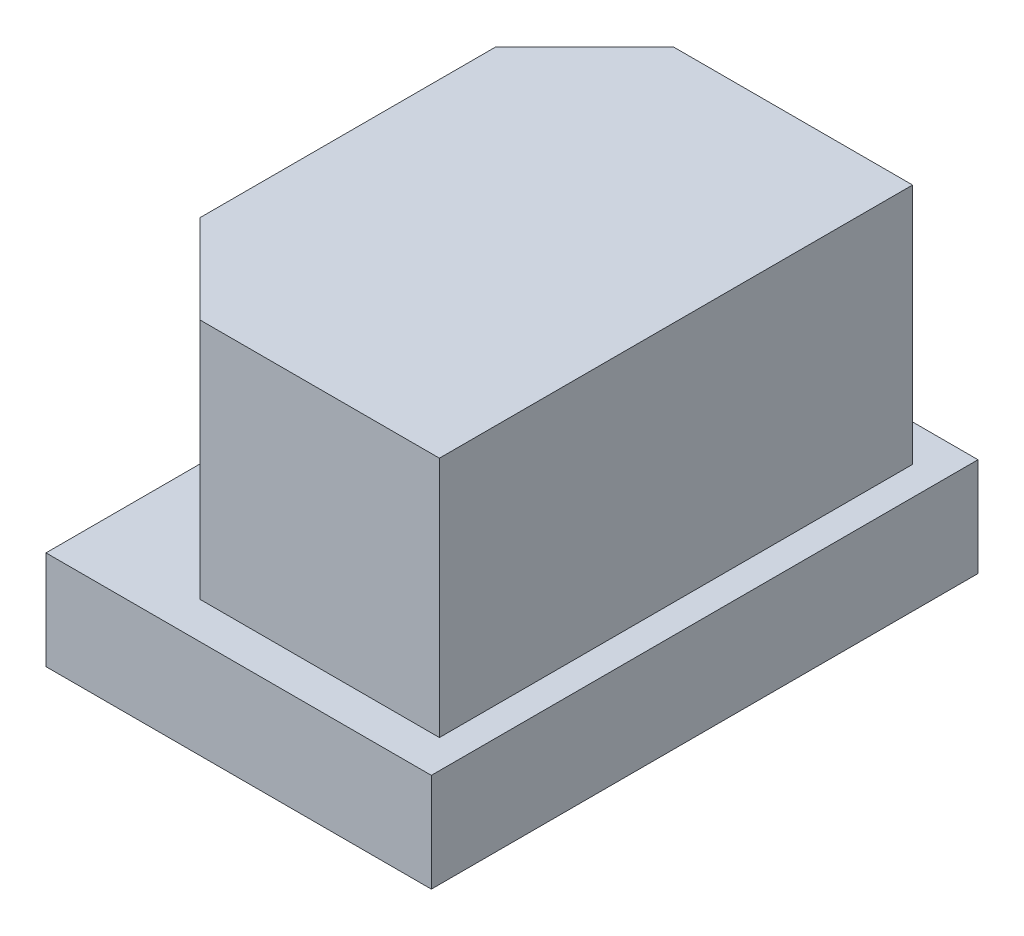
ISO-10303-21;
HEADER;
FILE_DESCRIPTION(('STEP AP214'),'2;1');
FILE_NAME('part.step','',(''),(''),'','','');
FILE_SCHEMA(('AUTOMOTIVE_DESIGN { 1 0 10303 214 1 1 1 1 }'));
ENDSEC;
DATA;
#1=APPLICATION_CONTEXT('core data for automotive mechanical design processes');
#2=APPLICATION_PROTOCOL_DEFINITION('international standard','automotive_design',2000,#1);
#3=PRODUCT_CONTEXT('',#1,'mechanical');
#4=PRODUCT('Part','Part','',(#3));
#5=PRODUCT_RELATED_PRODUCT_CATEGORY('part','',(#4));
#6=PRODUCT_DEFINITION_FORMATION('','',#4);
#7=PRODUCT_DEFINITION_CONTEXT('part definition',#1,'design');
#8=PRODUCT_DEFINITION('design','',#6,#7);
#9=PRODUCT_DEFINITION_SHAPE('','',#8);
#10=(LENGTH_UNIT() NAMED_UNIT(*) SI_UNIT(.MILLI.,.METRE.));
#11=(NAMED_UNIT(*) PLANE_ANGLE_UNIT() SI_UNIT($,.RADIAN.));
#12=(NAMED_UNIT(*) SI_UNIT($,.STERADIAN.) SOLID_ANGLE_UNIT());
#13=UNCERTAINTY_MEASURE_WITH_UNIT(LENGTH_MEASURE(1.E-05),#10,'distance_accuracy_value','');
#14=(GEOMETRIC_REPRESENTATION_CONTEXT(3) GLOBAL_UNCERTAINTY_ASSIGNED_CONTEXT((#13)) GLOBAL_UNIT_ASSIGNED_CONTEXT((#10,
#11,#12)) REPRESENTATION_CONTEXT('',''));
#15=CARTESIAN_POINT('',(0.,0.,0.));
#16=DIRECTION('',(0.,0.,1.));
#17=DIRECTION('',(1.,0.,0.));
#18=AXIS2_PLACEMENT_3D('',#15,#16,#17);
#19=CARTESIAN_POINT('',(0.,13.5,0.));
#20=DIRECTION('',(-1.,0.,0.));
#21=DIRECTION('',(0.,0.,1.));
#22=AXIS2_PLACEMENT_3D('',#19,#20,#21);
#23=PLANE('',#22);
#24=DIRECTION('',(0.,0.,-1.));
#25=VECTOR('',#24,1.);
#26=CARTESIAN_POINT('',(0.,0.,0.));
#27=LINE('',#26,#25);
#28=CARTESIAN_POINT('',(0.,0.,26.4));
#29=VERTEX_POINT('',#28);
#30=CARTESIAN_POINT('',(0.,0.,0.));
#31=VERTEX_POINT('',#30);
#32=EDGE_CURVE('E130',#29,#31,#27,.T.);
#33=ORIENTED_EDGE('',*,*,#32,.T.);
#34=DIRECTION('',(0.,-1.,0.));
#35=VECTOR('',#34,1.);
#36=CARTESIAN_POINT('',(0.,13.5,0.));
#37=LINE('',#36,#35);
#38=CARTESIAN_POINT('',(0.,13.5,0.));
#39=VERTEX_POINT('',#38);
#40=EDGE_CURVE('E11',#39,#31,#37,.T.);
#41=ORIENTED_EDGE('',*,*,#40,.F.);
#42=DIRECTION('',(0.,0.,-1.));
#43=VECTOR('',#42,1.);
#44=CARTESIAN_POINT('',(0.,13.5,0.));
#45=LINE('',#44,#43);
#46=CARTESIAN_POINT('',(0.,13.5,26.4));
#47=VERTEX_POINT('',#46);
#48=EDGE_CURVE('E139',#47,#39,#45,.T.);
#49=ORIENTED_EDGE('',*,*,#48,.F.);
#50=DIRECTION('',(0.,-1.,0.));
#51=VECTOR('',#50,1.);
#52=CARTESIAN_POINT('',(0.,13.5,26.4));
#53=LINE('',#52,#51);
#54=EDGE_CURVE('E150',#47,#29,#53,.T.);
#55=ORIENTED_EDGE('',*,*,#54,.T.);
#56=EDGE_LOOP('',(#33,#41,#49,#55));
#57=FACE_BOUND('',#56,.T.);
#58=ADVANCED_FACE('F33',(#57),#23,.F.);
#59=CARTESIAN_POINT('',(0.,13.5,0.));
#60=DIRECTION('',(0.,0.,1.));
#61=DIRECTION('',(1.,0.,0.));
#62=AXIS2_PLACEMENT_3D('',#59,#60,#61);
#63=PLANE('',#62);
#64=DIRECTION('',(-1.,0.,0.));
#65=VECTOR('',#64,1.);
#66=CARTESIAN_POINT('',(0.,0.,0.));
#67=LINE('',#66,#65);
#68=CARTESIAN_POINT('',(-13.3502525316942,0.,0.));
#69=VERTEX_POINT('',#68);
#70=EDGE_CURVE('E133',#31,#69,#67,.T.);
#71=ORIENTED_EDGE('',*,*,#70,.T.);
#72=DIRECTION('',(0.,-1.,0.));
#73=VECTOR('',#72,1.);
#74=CARTESIAN_POINT('',(-13.3502525316942,13.5,0.));
#75=LINE('',#74,#73);
#76=CARTESIAN_POINT('',(-13.3502525316942,13.5,0.));
#77=VERTEX_POINT('',#76);
#78=EDGE_CURVE('E41',#77,#69,#75,.T.);
#79=ORIENTED_EDGE('',*,*,#78,.F.);
#80=DIRECTION('',(-1.,0.,0.));
#81=VECTOR('',#80,1.);
#82=CARTESIAN_POINT('',(0.,13.5,0.));
#83=LINE('',#82,#81);
#84=EDGE_CURVE('E141',#39,#77,#83,.T.);
#85=ORIENTED_EDGE('',*,*,#84,.F.);
#86=ORIENTED_EDGE('',*,*,#40,.T.);
#87=EDGE_LOOP('',(#71,#79,#85,#86));
#88=FACE_BOUND('',#87,.T.);
#89=ADVANCED_FACE('F183',(#88),#63,.F.);
#90=CARTESIAN_POINT('',(-13.3502525316942,13.5,0.));
#91=DIRECTION('',(0.707106781186548,0.,0.707106781186547));
#92=DIRECTION('',(0.707106781186547,0.,-0.707106781186548));
#93=AXIS2_PLACEMENT_3D('',#90,#91,#92);
#94=PLANE('',#93);
#95=DIRECTION('',(-0.707106781186547,0.,0.707106781186548));
#96=VECTOR('',#95,1.);
#97=CARTESIAN_POINT('',(-13.3502525316942,0.,0.));
#98=LINE('',#97,#96);
#99=CARTESIAN_POINT('',(-18.3,0.,4.94974746830584));
#100=VERTEX_POINT('',#99);
#101=EDGE_CURVE('E154',#69,#100,#98,.T.);
#102=ORIENTED_EDGE('',*,*,#101,.T.);
#103=DIRECTION('',(0.,-1.,0.));
#104=VECTOR('',#103,1.);
#105=CARTESIAN_POINT('',(-18.3,13.5,4.94974746830584));
#106=LINE('',#105,#104);
#107=CARTESIAN_POINT('',(-18.3,13.5,4.94974746830584));
#108=VERTEX_POINT('',#107);
#109=EDGE_CURVE('E173',#108,#100,#106,.T.);
#110=ORIENTED_EDGE('',*,*,#109,.F.);
#111=DIRECTION('',(-0.707106781186547,0.,0.707106781186548));
#112=VECTOR('',#111,1.);
#113=CARTESIAN_POINT('',(-13.3502525316942,13.5,0.));
#114=LINE('',#113,#112);
#115=EDGE_CURVE('E144',#77,#108,#114,.T.);
#116=ORIENTED_EDGE('',*,*,#115,.F.);
#117=ORIENTED_EDGE('',*,*,#78,.T.);
#118=EDGE_LOOP('',(#102,#110,#116,#117));
#119=FACE_BOUND('',#118,.T.);
#120=ADVANCED_FACE('F179',(#119),#94,.F.);
#121=CARTESIAN_POINT('',(-18.3,13.5,4.94974746830584));
#122=DIRECTION('',(1.,0.,0.));
#123=DIRECTION('',(0.,0.,-1.));
#124=AXIS2_PLACEMENT_3D('',#121,#122,#123);
#125=PLANE('',#124);
#126=DIRECTION('',(0.,0.,1.));
#127=VECTOR('',#126,1.);
#128=CARTESIAN_POINT('',(-18.3,0.,4.94974746830584));
#129=LINE('',#128,#127);
#130=CARTESIAN_POINT('',(-18.3,0.,21.4502525316942));
#131=VERTEX_POINT('',#130);
#132=EDGE_CURVE('E157',#100,#131,#129,.T.);
#133=ORIENTED_EDGE('',*,*,#132,.T.);
#134=DIRECTION('',(0.,-1.,0.));
#135=VECTOR('',#134,1.);
#136=CARTESIAN_POINT('',(-18.3,13.5,21.4502525316942));
#137=LINE('',#136,#135);
#138=CARTESIAN_POINT('',(-18.3,13.5,21.4502525316942));
#139=VERTEX_POINT('',#138);
#140=EDGE_CURVE('E170',#139,#131,#137,.T.);
#141=ORIENTED_EDGE('',*,*,#140,.F.);
#142=DIRECTION('',(0.,0.,1.));
#143=VECTOR('',#142,1.);
#144=CARTESIAN_POINT('',(-18.3,13.5,4.94974746830584));
#145=LINE('',#144,#143);
#146=EDGE_CURVE('E146',#108,#139,#145,.T.);
#147=ORIENTED_EDGE('',*,*,#146,.F.);
#148=ORIENTED_EDGE('',*,*,#109,.T.);
#149=EDGE_LOOP('',(#133,#141,#147,#148));
#150=FACE_BOUND('',#149,.T.);
#151=ADVANCED_FACE('F189',(#150),#125,.F.);
#152=CARTESIAN_POINT('',(-13.3502525316942,13.5,26.4));
#153=DIRECTION('',(0.707106781186548,0.,-0.707106781186547));
#154=DIRECTION('',(-0.707106781186547,0.,-0.707106781186548));
#155=AXIS2_PLACEMENT_3D('',#152,#153,#154);
#156=PLANE('',#155);
#157=DIRECTION('',(0.707106781186547,0.,0.707106781186548));
#158=VECTOR('',#157,1.);
#159=CARTESIAN_POINT('',(-13.3502525316942,0.,26.4));
#160=LINE('',#159,#158);
#161=CARTESIAN_POINT('',(-13.3502525316942,0.,26.4));
#162=VERTEX_POINT('',#161);
#163=EDGE_CURVE('E160',#131,#162,#160,.T.);
#164=ORIENTED_EDGE('',*,*,#163,.T.);
#165=DIRECTION('',(0.,-1.,0.));
#166=VECTOR('',#165,1.);
#167=CARTESIAN_POINT('',(-13.3502525316942,13.5,26.4));
#168=LINE('',#167,#166);
#169=CARTESIAN_POINT('',(-13.3502525316942,13.5,26.4));
#170=VERTEX_POINT('',#169);
#171=EDGE_CURVE('E167',#170,#162,#168,.T.);
#172=ORIENTED_EDGE('',*,*,#171,.F.);
#173=DIRECTION('',(0.707106781186547,0.,0.707106781186548));
#174=VECTOR('',#173,1.);
#175=CARTESIAN_POINT('',(-13.3502525316942,13.5,26.4));
#176=LINE('',#175,#174);
#177=EDGE_CURVE('E148',#139,#170,#176,.T.);
#178=ORIENTED_EDGE('',*,*,#177,.F.);
#179=ORIENTED_EDGE('',*,*,#140,.T.);
#180=EDGE_LOOP('',(#164,#172,#178,#179));
#181=FACE_BOUND('',#180,.T.);
#182=ADVANCED_FACE('F193',(#181),#156,.F.);
#183=CARTESIAN_POINT('',(0.,13.5,26.4));
#184=DIRECTION('',(0.,0.,-1.));
#185=DIRECTION('',(-1.,0.,0.));
#186=AXIS2_PLACEMENT_3D('',#183,#184,#185);
#187=PLANE('',#186);
#188=DIRECTION('',(1.,0.,0.));
#189=VECTOR('',#188,1.);
#190=CARTESIAN_POINT('',(0.,0.,26.4));
#191=LINE('',#190,#189);
#192=EDGE_CURVE('E142',#162,#29,#191,.T.);
#193=ORIENTED_EDGE('',*,*,#192,.T.);
#194=ORIENTED_EDGE('',*,*,#54,.F.);
#195=DIRECTION('',(1.,0.,0.));
#196=VECTOR('',#195,1.);
#197=CARTESIAN_POINT('',(0.,13.5,26.4));
#198=LINE('',#197,#196);
#199=EDGE_CURVE('E48',#170,#47,#198,.T.);
#200=ORIENTED_EDGE('',*,*,#199,.F.);
#201=ORIENTED_EDGE('',*,*,#171,.T.);
#202=EDGE_LOOP('',(#193,#194,#200,#201));
#203=FACE_BOUND('',#202,.T.);
#204=ADVANCED_FACE('F199',(#203),#187,.F.);
#205=CARTESIAN_POINT('',(0.,13.5,0.));
#206=DIRECTION('',(0.,-1.,0.));
#207=DIRECTION('',(0.,0.,-1.));
#208=AXIS2_PLACEMENT_3D('',#205,#206,#207);
#209=PLANE('',#208);
#210=ORIENTED_EDGE('',*,*,#48,.T.);
#211=ORIENTED_EDGE('',*,*,#84,.T.);
#212=ORIENTED_EDGE('',*,*,#115,.T.);
#213=ORIENTED_EDGE('',*,*,#146,.T.);
#214=ORIENTED_EDGE('',*,*,#177,.T.);
#215=ORIENTED_EDGE('',*,*,#199,.T.);
#216=EDGE_LOOP('',(#210,#211,#212,#213,#214,#215));
#217=FACE_BOUND('',#216,.T.);
#218=ADVANCED_FACE('F195',(#217),#209,.F.);
#219=CARTESIAN_POINT('',(0.,0.,0.));
#220=DIRECTION('',(0.,1.,0.));
#221=DIRECTION('',(0.,0.,1.));
#222=AXIS2_PLACEMENT_3D('',#219,#220,#221);
#223=PLANE('',#222);
#224=DIRECTION('',(0.,0.,1.));
#225=VECTOR('',#224,1.);
#226=CARTESIAN_POINT('',(1.6,0.,-2.05));
#227=LINE('',#226,#225);
#228=CARTESIAN_POINT('',(1.6,0.,-2.05));
#229=VERTEX_POINT('',#228);
#230=CARTESIAN_POINT('',(1.6,0.,28.45));
#231=VERTEX_POINT('',#230);
#232=EDGE_CURVE('E129',#229,#231,#227,.T.);
#233=ORIENTED_EDGE('',*,*,#232,.F.);
#234=DIRECTION('',(1.,0.,0.));
#235=VECTOR('',#234,1.);
#236=CARTESIAN_POINT('',(-19.9,0.,-2.05));
#237=LINE('',#236,#235);
#238=CARTESIAN_POINT('',(-19.9,0.,-2.05));
#239=VERTEX_POINT('',#238);
#240=EDGE_CURVE('E125',#239,#229,#237,.T.);
#241=ORIENTED_EDGE('',*,*,#240,.F.);
#242=DIRECTION('',(0.,0.,-1.));
#243=VECTOR('',#242,1.);
#244=CARTESIAN_POINT('',(-19.9,0.,-2.05));
#245=LINE('',#244,#243);
#246=CARTESIAN_POINT('',(-19.9,0.,28.45));
#247=VERTEX_POINT('',#246);
#248=EDGE_CURVE('E293',#247,#239,#245,.T.);
#249=ORIENTED_EDGE('',*,*,#248,.F.);
#250=DIRECTION('',(-1.,0.,0.));
#251=VECTOR('',#250,1.);
#252=CARTESIAN_POINT('',(-19.9,0.,28.45));
#253=LINE('',#252,#251);
#254=EDGE_CURVE('E296',#231,#247,#253,.T.);
#255=ORIENTED_EDGE('',*,*,#254,.F.);
#256=EDGE_LOOP('',(#233,#241,#249,#255));
#257=FACE_BOUND('',#256,.T.);
#258=ORIENTED_EDGE('',*,*,#32,.F.);
#259=ORIENTED_EDGE('',*,*,#192,.F.);
#260=ORIENTED_EDGE('',*,*,#163,.F.);
#261=ORIENTED_EDGE('',*,*,#132,.F.);
#262=ORIENTED_EDGE('',*,*,#101,.F.);
#263=ORIENTED_EDGE('',*,*,#70,.F.);
#264=EDGE_LOOP('',(#258,#259,#260,#261,#262,#263));
#265=FACE_BOUND('',#264,.T.);
#266=ADVANCED_FACE('F186',(#257,#265),#223,.T.);
#267=CARTESIAN_POINT('',(1.6,-5.5,-2.05));
#268=DIRECTION('',(-1.,0.,0.));
#269=DIRECTION('',(0.,0.,1.));
#270=AXIS2_PLACEMENT_3D('',#267,#268,#269);
#271=PLANE('',#270);
#272=ORIENTED_EDGE('',*,*,#232,.T.);
#273=DIRECTION('',(0.,1.,0.));
#274=VECTOR('',#273,1.);
#275=CARTESIAN_POINT('',(1.6,-5.5,28.45));
#276=LINE('',#275,#274);
#277=CARTESIAN_POINT('',(1.6,-5.5,28.45));
#278=VERTEX_POINT('',#277);
#279=EDGE_CURVE('E109',#278,#231,#276,.T.);
#280=ORIENTED_EDGE('',*,*,#279,.F.);
#281=DIRECTION('',(0.,0.,1.));
#282=VECTOR('',#281,1.);
#283=CARTESIAN_POINT('',(1.6,-5.5,-2.05));
#284=LINE('',#283,#282);
#285=CARTESIAN_POINT('',(1.6,-5.5,-2.05));
#286=VERTEX_POINT('',#285);
#287=EDGE_CURVE('E116',#286,#278,#284,.T.);
#288=ORIENTED_EDGE('',*,*,#287,.F.);
#289=DIRECTION('',(0.,1.,0.));
#290=VECTOR('',#289,1.);
#291=CARTESIAN_POINT('',(1.6,-5.5,-2.05));
#292=LINE('',#291,#290);
#293=EDGE_CURVE('E290',#286,#229,#292,.T.);
#294=ORIENTED_EDGE('',*,*,#293,.T.);
#295=EDGE_LOOP('',(#272,#280,#288,#294));
#296=FACE_BOUND('',#295,.T.);
#297=ADVANCED_FACE('F127',(#296),#271,.F.);
#298=CARTESIAN_POINT('',(-19.9,-5.5,28.45));
#299=DIRECTION('',(0.,0.,-1.));
#300=DIRECTION('',(-1.,0.,0.));
#301=AXIS2_PLACEMENT_3D('',#298,#299,#300);
#302=PLANE('',#301);
#303=ORIENTED_EDGE('',*,*,#254,.T.);
#304=DIRECTION('',(0.,1.,0.));
#305=VECTOR('',#304,1.);
#306=CARTESIAN_POINT('',(-19.9,-5.5,28.45));
#307=LINE('',#306,#305);
#308=CARTESIAN_POINT('',(-19.9,-5.5,28.45));
#309=VERTEX_POINT('',#308);
#310=EDGE_CURVE('E112',#309,#247,#307,.T.);
#311=ORIENTED_EDGE('',*,*,#310,.F.);
#312=DIRECTION('',(-1.,0.,0.));
#313=VECTOR('',#312,1.);
#314=CARTESIAN_POINT('',(-19.9,-5.5,28.45));
#315=LINE('',#314,#313);
#316=EDGE_CURVE('E105',#278,#309,#315,.T.);
#317=ORIENTED_EDGE('',*,*,#316,.F.);
#318=ORIENTED_EDGE('',*,*,#279,.T.);
#319=EDGE_LOOP('',(#303,#311,#317,#318));
#320=FACE_BOUND('',#319,.T.);
#321=ADVANCED_FACE('F107',(#320),#302,.F.);
#322=CARTESIAN_POINT('',(-19.9,-5.5,-2.05));
#323=DIRECTION('',(1.,0.,0.));
#324=DIRECTION('',(0.,0.,-1.));
#325=AXIS2_PLACEMENT_3D('',#322,#323,#324);
#326=PLANE('',#325);
#327=ORIENTED_EDGE('',*,*,#248,.T.);
#328=DIRECTION('',(0.,1.,0.));
#329=VECTOR('',#328,1.);
#330=CARTESIAN_POINT('',(-19.9,-5.5,-2.05));
#331=LINE('',#330,#329);
#332=CARTESIAN_POINT('',(-19.9,-5.5,-2.05));
#333=VERTEX_POINT('',#332);
#334=EDGE_CURVE('E135',#333,#239,#331,.T.);
#335=ORIENTED_EDGE('',*,*,#334,.F.);
#336=DIRECTION('',(0.,0.,-1.));
#337=VECTOR('',#336,1.);
#338=CARTESIAN_POINT('',(-19.9,-5.5,-2.05));
#339=LINE('',#338,#337);
#340=EDGE_CURVE('E115',#309,#333,#339,.T.);
#341=ORIENTED_EDGE('',*,*,#340,.F.);
#342=ORIENTED_EDGE('',*,*,#310,.T.);
#343=EDGE_LOOP('',(#327,#335,#341,#342));
#344=FACE_BOUND('',#343,.T.);
#345=ADVANCED_FACE('F257',(#344),#326,.F.);
#346=CARTESIAN_POINT('',(-19.9,-5.5,-2.05));
#347=DIRECTION('',(0.,0.,1.));
#348=DIRECTION('',(1.,0.,0.));
#349=AXIS2_PLACEMENT_3D('',#346,#347,#348);
#350=PLANE('',#349);
#351=ORIENTED_EDGE('',*,*,#240,.T.);
#352=ORIENTED_EDGE('',*,*,#293,.F.);
#353=DIRECTION('',(1.,0.,0.));
#354=VECTOR('',#353,1.);
#355=CARTESIAN_POINT('',(-19.9,-5.5,-2.05));
#356=LINE('',#355,#354);
#357=EDGE_CURVE('E121',#333,#286,#356,.T.);
#358=ORIENTED_EDGE('',*,*,#357,.F.);
#359=ORIENTED_EDGE('',*,*,#334,.T.);
#360=EDGE_LOOP('',(#351,#352,#358,#359));
#361=FACE_BOUND('',#360,.T.);
#362=ADVANCED_FACE('F266',(#361),#350,.F.);
#363=CARTESIAN_POINT('',(0.,-5.5,0.));
#364=DIRECTION('',(0.,1.,0.));
#365=DIRECTION('',(0.,0.,1.));
#366=AXIS2_PLACEMENT_3D('',#363,#364,#365);
#367=PLANE('',#366);
#368=ORIENTED_EDGE('',*,*,#287,.T.);
#369=ORIENTED_EDGE('',*,*,#316,.T.);
#370=ORIENTED_EDGE('',*,*,#340,.T.);
#371=ORIENTED_EDGE('',*,*,#357,.T.);
#372=EDGE_LOOP('',(#368,#369,#370,#371));
#373=FACE_BOUND('',#372,.T.);
#374=ADVANCED_FACE('F119',(#373),#367,.F.);
#375=CLOSED_SHELL('',(#58,#89,#120,#151,#182,#204,#218,#266,#297,#321,#345,#362,#374));
#376=MANIFOLD_SOLID_BREP('B2',#375);
#377=ADVANCED_BREP_SHAPE_REPRESENTATION('',(#18,#376),#14);
#378=SHAPE_DEFINITION_REPRESENTATION(#9,#377);
ENDSEC;
END-ISO-10303-21;
